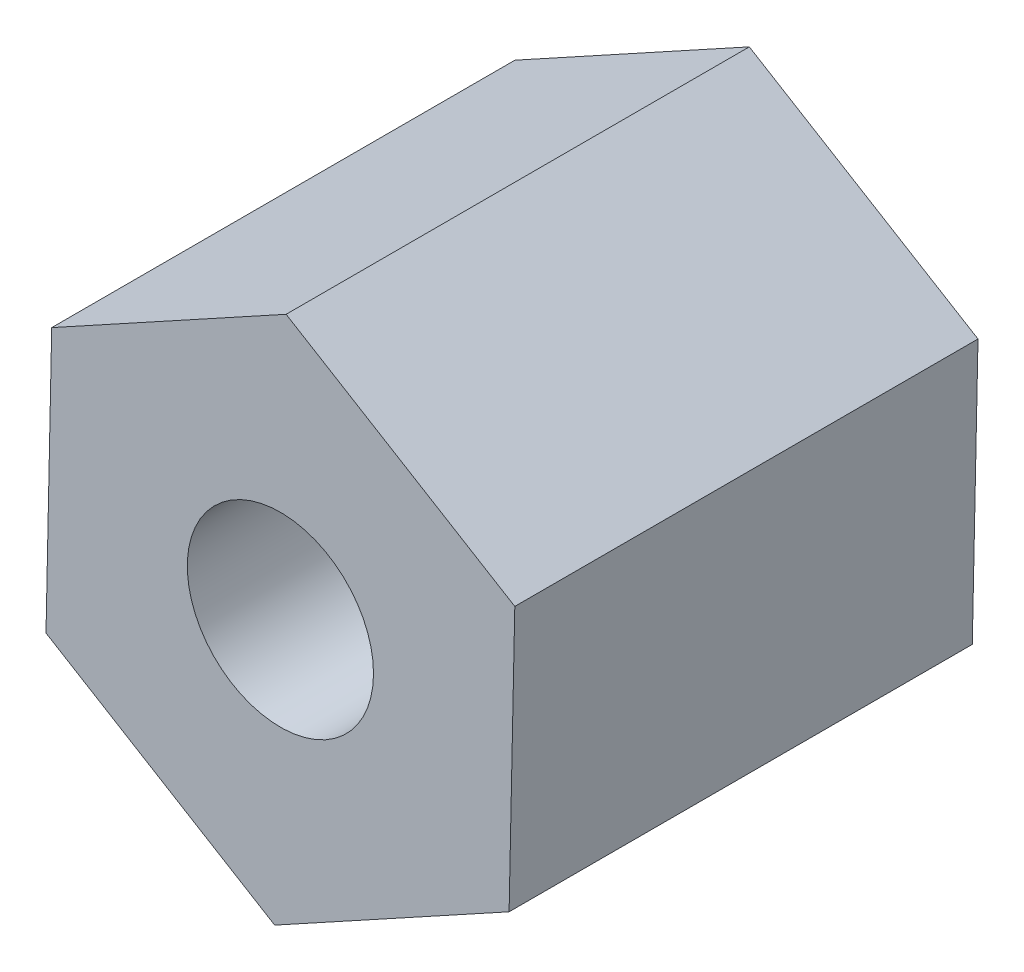
ISO-10303-21;
HEADER;
FILE_DESCRIPTION(('STEP AP214'),'2;1');
FILE_NAME('part.step','',(''),(''),'','','');
FILE_SCHEMA(('AUTOMOTIVE_DESIGN { 1 0 10303 214 1 1 1 1 }'));
ENDSEC;
DATA;
#1=APPLICATION_CONTEXT('core data for automotive mechanical design processes');
#2=APPLICATION_PROTOCOL_DEFINITION('international standard','automotive_design',2000,#1);
#3=PRODUCT_CONTEXT('',#1,'mechanical');
#4=PRODUCT('Part','Part','',(#3));
#5=PRODUCT_RELATED_PRODUCT_CATEGORY('part','',(#4));
#6=PRODUCT_DEFINITION_FORMATION('','',#4);
#7=PRODUCT_DEFINITION_CONTEXT('part definition',#1,'design');
#8=PRODUCT_DEFINITION('design','',#6,#7);
#9=PRODUCT_DEFINITION_SHAPE('','',#8);
#10=(LENGTH_UNIT() NAMED_UNIT(*) SI_UNIT(.MILLI.,.METRE.));
#11=(NAMED_UNIT(*) PLANE_ANGLE_UNIT() SI_UNIT($,.RADIAN.));
#12=(NAMED_UNIT(*) SI_UNIT($,.STERADIAN.) SOLID_ANGLE_UNIT());
#13=UNCERTAINTY_MEASURE_WITH_UNIT(LENGTH_MEASURE(1.E-05),#10,'distance_accuracy_value','');
#14=(GEOMETRIC_REPRESENTATION_CONTEXT(3) GLOBAL_UNCERTAINTY_ASSIGNED_CONTEXT((#13)) GLOBAL_UNIT_ASSIGNED_CONTEXT((#10,
#11,#12)) REPRESENTATION_CONTEXT('',''));
#15=CARTESIAN_POINT('',(0.,0.,0.));
#16=DIRECTION('',(0.,0.,1.));
#17=DIRECTION('',(1.,0.,0.));
#18=AXIS2_PLACEMENT_3D('',#15,#16,#17);
#19=CARTESIAN_POINT('',(-0.156631064855326,-7.33067527877586,12.7));
#20=DIRECTION('',(-0.481386174884368,0.876508614122072,0.));
#21=DIRECTION('',(-0.876508614122073,-0.481386174884369,0.));
#22=AXIS2_PLACEMENT_3D('',#19,#20,#21);
#23=PLANE('',#22);
#24=DIRECTION('',(0.876508614122072,0.481386174884369,0.));
#25=VECTOR('',#24,1.);
#26=CARTESIAN_POINT('',(-0.156631064855326,-7.33067527877586,0.));
#27=LINE('',#26,#25);
#28=CARTESIAN_POINT('',(-0.156631064855326,-7.33067527877586,0.));
#29=VERTEX_POINT('',#28);
#30=CARTESIAN_POINT('',(6.27023548588681,-3.80098412057446,0.));
#31=VERTEX_POINT('',#30);
#32=EDGE_CURVE('E116',#29,#31,#27,.T.);
#33=ORIENTED_EDGE('',*,*,#32,.T.);
#34=DIRECTION('',(0.,0.,-1.));
#35=VECTOR('',#34,1.);
#36=CARTESIAN_POINT('',(6.27023548588681,-3.80098412057446,12.7));
#37=LINE('',#36,#35);
#38=CARTESIAN_POINT('',(6.27023548588681,-3.80098412057446,12.7));
#39=VERTEX_POINT('',#38);
#40=EDGE_CURVE('E11',#39,#31,#37,.T.);
#41=ORIENTED_EDGE('',*,*,#40,.F.);
#42=DIRECTION('',(0.876508614122072,0.481386174884369,0.));
#43=VECTOR('',#42,1.);
#44=CARTESIAN_POINT('',(-0.156631064855326,-7.33067527877586,12.7));
#45=LINE('',#44,#43);
#46=CARTESIAN_POINT('',(-0.156631064855326,-7.33067527877586,12.7));
#47=VERTEX_POINT('',#46);
#48=EDGE_CURVE('E127',#47,#39,#45,.T.);
#49=ORIENTED_EDGE('',*,*,#48,.F.);
#50=DIRECTION('',(0.,0.,-1.));
#51=VECTOR('',#50,1.);
#52=CARTESIAN_POINT('',(-0.156631064855326,-7.33067527877586,12.7));
#53=LINE('',#52,#51);
#54=EDGE_CURVE('E112',#47,#29,#53,.T.);
#55=ORIENTED_EDGE('',*,*,#54,.T.);
#56=EDGE_LOOP('',(#33,#41,#49,#55));
#57=FACE_BOUND('',#56,.T.);
#58=ADVANCED_FACE('F32',(#57),#23,.F.);
#59=CARTESIAN_POINT('',(6.27023548588681,-3.80098412057446,12.7));
#60=DIRECTION('',(-0.999771813907791,0.0213616505805546,0.));
#61=DIRECTION('',(-0.0213616505805546,-0.999771813907791,0.));
#62=AXIS2_PLACEMENT_3D('',#59,#60,#61);
#63=PLANE('',#62);
#64=DIRECTION('',(0.0213616505805546,0.999771813907791,0.));
#65=VECTOR('',#64,1.);
#66=CARTESIAN_POINT('',(6.27023548588681,-3.80098412057446,0.));
#67=LINE('',#66,#65);
#68=CARTESIAN_POINT('',(6.42686655074214,3.52969115820141,0.));
#69=VERTEX_POINT('',#68);
#70=EDGE_CURVE('E119',#31,#69,#67,.T.);
#71=ORIENTED_EDGE('',*,*,#70,.T.);
#72=DIRECTION('',(0.,0.,-1.));
#73=VECTOR('',#72,1.);
#74=CARTESIAN_POINT('',(6.42686655074214,3.52969115820141,12.7));
#75=LINE('',#74,#73);
#76=CARTESIAN_POINT('',(6.42686655074214,3.52969115820141,12.7));
#77=VERTEX_POINT('',#76);
#78=EDGE_CURVE('E40',#77,#69,#75,.T.);
#79=ORIENTED_EDGE('',*,*,#78,.F.);
#80=DIRECTION('',(0.0213616505805546,0.999771813907791,0.));
#81=VECTOR('',#80,1.);
#82=CARTESIAN_POINT('',(6.27023548588681,-3.80098412057446,12.7));
#83=LINE('',#82,#81);
#84=EDGE_CURVE('E85',#39,#77,#83,.T.);
#85=ORIENTED_EDGE('',*,*,#84,.F.);
#86=ORIENTED_EDGE('',*,*,#40,.T.);
#87=EDGE_LOOP('',(#71,#79,#85,#86));
#88=FACE_BOUND('',#87,.T.);
#89=ADVANCED_FACE('F152',(#88),#63,.F.);
#90=CARTESIAN_POINT('',(6.42686655074214,3.52969115820141,12.7));
#91=DIRECTION('',(-0.518385639023422,-0.855146963541518,0.));
#92=DIRECTION('',(0.855146963541518,-0.518385639023422,0.));
#93=AXIS2_PLACEMENT_3D('',#90,#91,#92);
#94=PLANE('',#93);
#95=DIRECTION('',(-0.855146963541518,0.518385639023422,0.));
#96=VECTOR('',#95,1.);
#97=CARTESIAN_POINT('',(6.42686655074214,3.52969115820141,0.));
#98=LINE('',#97,#96);
#99=CARTESIAN_POINT('',(0.156631064855326,7.33067527877586,0.));
#100=VERTEX_POINT('',#99);
#101=EDGE_CURVE('E122',#69,#100,#98,.T.);
#102=ORIENTED_EDGE('',*,*,#101,.T.);
#103=DIRECTION('',(0.,0.,-1.));
#104=VECTOR('',#103,1.);
#105=CARTESIAN_POINT('',(0.156631064855326,7.33067527877586,12.7));
#106=LINE('',#105,#104);
#107=CARTESIAN_POINT('',(0.156631064855326,7.33067527877586,12.7));
#108=VERTEX_POINT('',#107);
#109=EDGE_CURVE('E107',#108,#100,#106,.T.);
#110=ORIENTED_EDGE('',*,*,#109,.F.);
#111=DIRECTION('',(-0.855146963541518,0.518385639023422,0.));
#112=VECTOR('',#111,1.);
#113=CARTESIAN_POINT('',(6.42686655074214,3.52969115820141,12.7));
#114=LINE('',#113,#112);
#115=EDGE_CURVE('E98',#77,#108,#114,.T.);
#116=ORIENTED_EDGE('',*,*,#115,.F.);
#117=ORIENTED_EDGE('',*,*,#78,.T.);
#118=EDGE_LOOP('',(#102,#110,#116,#117));
#119=FACE_BOUND('',#118,.T.);
#120=ADVANCED_FACE('F133',(#119),#94,.F.);
#121=CARTESIAN_POINT('',(0.156631064855326,7.33067527877586,12.7));
#122=DIRECTION('',(0.481386174884368,-0.876508614122072,0.));
#123=DIRECTION('',(0.876508614122073,0.481386174884369,0.));
#124=AXIS2_PLACEMENT_3D('',#121,#122,#123);
#125=PLANE('',#124);
#126=DIRECTION('',(-0.876508614122073,-0.481386174884368,0.));
#127=VECTOR('',#126,1.);
#128=CARTESIAN_POINT('',(0.156631064855326,7.33067527877586,0.));
#129=LINE('',#128,#127);
#130=CARTESIAN_POINT('',(-6.27023548588681,3.80098412057446,0.));
#131=VERTEX_POINT('',#130);
#132=EDGE_CURVE('E106',#100,#131,#129,.T.);
#133=ORIENTED_EDGE('',*,*,#132,.T.);
#134=DIRECTION('',(0.,0.,-1.));
#135=VECTOR('',#134,1.);
#136=CARTESIAN_POINT('',(-6.27023548588681,3.80098412057446,12.7));
#137=LINE('',#136,#135);
#138=CARTESIAN_POINT('',(-6.27023548588681,3.80098412057446,12.7));
#139=VERTEX_POINT('',#138);
#140=EDGE_CURVE('E103',#139,#131,#137,.T.);
#141=ORIENTED_EDGE('',*,*,#140,.F.);
#142=DIRECTION('',(-0.876508614122073,-0.481386174884368,0.));
#143=VECTOR('',#142,1.);
#144=CARTESIAN_POINT('',(0.156631064855326,7.33067527877586,12.7));
#145=LINE('',#144,#143);
#146=EDGE_CURVE('E92',#108,#139,#145,.T.);
#147=ORIENTED_EDGE('',*,*,#146,.F.);
#148=ORIENTED_EDGE('',*,*,#109,.T.);
#149=EDGE_LOOP('',(#133,#141,#147,#148));
#150=FACE_BOUND('',#149,.T.);
#151=ADVANCED_FACE('F104',(#150),#125,.F.);
#152=CARTESIAN_POINT('',(-6.27023548588681,3.80098412057446,12.7));
#153=DIRECTION('',(0.999771813907791,-0.0213616505805544,0.));
#154=DIRECTION('',(0.0213616505805544,0.999771813907791,0.));
#155=AXIS2_PLACEMENT_3D('',#152,#153,#154);
#156=PLANE('',#155);
#157=DIRECTION('',(-0.0213616505805544,-0.999771813907791,0.));
#158=VECTOR('',#157,1.);
#159=CARTESIAN_POINT('',(-6.27023548588681,3.80098412057446,0.));
#160=LINE('',#159,#158);
#161=CARTESIAN_POINT('',(-6.42686655074213,-3.52969115820141,0.));
#162=VERTEX_POINT('',#161);
#163=EDGE_CURVE('E71',#131,#162,#160,.T.);
#164=ORIENTED_EDGE('',*,*,#163,.T.);
#165=DIRECTION('',(0.,0.,-1.));
#166=VECTOR('',#165,1.);
#167=CARTESIAN_POINT('',(-6.42686655074213,-3.52969115820141,12.7));
#168=LINE('',#167,#166);
#169=CARTESIAN_POINT('',(-6.42686655074213,-3.52969115820141,12.7));
#170=VERTEX_POINT('',#169);
#171=EDGE_CURVE('E108',#170,#162,#168,.T.);
#172=ORIENTED_EDGE('',*,*,#171,.F.);
#173=DIRECTION('',(-0.0213616505805544,-0.999771813907791,0.));
#174=VECTOR('',#173,1.);
#175=CARTESIAN_POINT('',(-6.27023548588681,3.80098412057446,12.7));
#176=LINE('',#175,#174);
#177=EDGE_CURVE('E96',#139,#170,#176,.T.);
#178=ORIENTED_EDGE('',*,*,#177,.F.);
#179=ORIENTED_EDGE('',*,*,#140,.T.);
#180=EDGE_LOOP('',(#164,#172,#178,#179));
#181=FACE_BOUND('',#180,.T.);
#182=ADVANCED_FACE('F110',(#181),#156,.F.);
#183=CARTESIAN_POINT('',(-6.42686655074213,-3.52969115820141,12.7));
#184=DIRECTION('',(0.518385639023422,0.855146963541518,0.));
#185=DIRECTION('',(-0.855146963541518,0.518385639023422,0.));
#186=AXIS2_PLACEMENT_3D('',#183,#184,#185);
#187=PLANE('',#186);
#188=DIRECTION('',(0.855146963541518,-0.518385639023422,0.));
#189=VECTOR('',#188,1.);
#190=CARTESIAN_POINT('',(-6.42686655074213,-3.52969115820141,0.));
#191=LINE('',#190,#189);
#192=EDGE_CURVE('E77',#162,#29,#191,.T.);
#193=ORIENTED_EDGE('',*,*,#192,.T.);
#194=ORIENTED_EDGE('',*,*,#54,.F.);
#195=DIRECTION('',(0.855146963541518,-0.518385639023422,0.));
#196=VECTOR('',#195,1.);
#197=CARTESIAN_POINT('',(-6.42686655074213,-3.52969115820141,12.7));
#198=LINE('',#197,#196);
#199=EDGE_CURVE('E48',#170,#47,#198,.T.);
#200=ORIENTED_EDGE('',*,*,#199,.F.);
#201=ORIENTED_EDGE('',*,*,#171,.T.);
#202=EDGE_LOOP('',(#193,#194,#200,#201));
#203=FACE_BOUND('',#202,.T.);
#204=ADVANCED_FACE('F140',(#203),#187,.F.);
#205=CARTESIAN_POINT('',(0.,0.,12.7));
#206=DIRECTION('',(0.,0.,1.));
#207=DIRECTION('',(1.,0.,0.));
#208=AXIS2_PLACEMENT_3D('',#205,#206,#207);
#209=PLANE('',#208);
#210=CARTESIAN_POINT('',(0.,0.,12.7));
#211=DIRECTION('',(0.,0.,1.));
#212=DIRECTION('',(1.,0.,0.));
#213=AXIS2_PLACEMENT_3D('',#210,#211,#212);
#214=CIRCLE('',#213,2.5527);
#215=CARTESIAN_POINT('',(2.5527,0.,12.7));
#216=VERTEX_POINT('',#215);
#217=EDGE_CURVE('E207',#216,#216,#214,.T.);
#218=ORIENTED_EDGE('',*,*,#217,.F.);
#219=EDGE_LOOP('',(#218));
#220=FACE_BOUND('',#219,.T.);
#221=ORIENTED_EDGE('',*,*,#48,.T.);
#222=ORIENTED_EDGE('',*,*,#84,.T.);
#223=ORIENTED_EDGE('',*,*,#115,.T.);
#224=ORIENTED_EDGE('',*,*,#146,.T.);
#225=ORIENTED_EDGE('',*,*,#177,.T.);
#226=ORIENTED_EDGE('',*,*,#199,.T.);
#227=EDGE_LOOP('',(#221,#222,#223,#224,#225,#226));
#228=FACE_BOUND('',#227,.T.);
#229=ADVANCED_FACE('F94',(#220,#228),#209,.T.);
#230=CARTESIAN_POINT('',(0.,0.,0.));
#231=DIRECTION('',(0.,0.,1.));
#232=DIRECTION('',(1.,0.,0.));
#233=AXIS2_PLACEMENT_3D('',#230,#231,#232);
#234=PLANE('',#233);
#235=CARTESIAN_POINT('',(0.,0.,0.));
#236=DIRECTION('',(0.,0.,1.));
#237=DIRECTION('',(1.,0.,0.));
#238=AXIS2_PLACEMENT_3D('',#235,#236,#237);
#239=CIRCLE('',#238,2.5527);
#240=CARTESIAN_POINT('',(2.5527,0.,0.));
#241=VERTEX_POINT('',#240);
#242=EDGE_CURVE('E120',#241,#241,#239,.T.);
#243=ORIENTED_EDGE('',*,*,#242,.T.);
#244=EDGE_LOOP('',(#243));
#245=FACE_BOUND('',#244,.T.);
#246=ORIENTED_EDGE('',*,*,#32,.F.);
#247=ORIENTED_EDGE('',*,*,#192,.F.);
#248=ORIENTED_EDGE('',*,*,#163,.F.);
#249=ORIENTED_EDGE('',*,*,#132,.F.);
#250=ORIENTED_EDGE('',*,*,#101,.F.);
#251=ORIENTED_EDGE('',*,*,#70,.F.);
#252=EDGE_LOOP('',(#246,#247,#248,#249,#250,#251));
#253=FACE_BOUND('',#252,.T.);
#254=ADVANCED_FACE('F136',(#245,#253),#234,.F.);
#255=CARTESIAN_POINT('',(0.,0.,12.7));
#256=DIRECTION('',(0.,0.,1.));
#257=DIRECTION('',(1.,0.,0.));
#258=AXIS2_PLACEMENT_3D('',#255,#256,#257);
#259=CYLINDRICAL_SURFACE('',#258,2.5527);
#260=ORIENTED_EDGE('',*,*,#242,.F.);
#261=EDGE_LOOP('',(#260));
#262=FACE_BOUND('',#261,.T.);
#263=ORIENTED_EDGE('',*,*,#217,.T.);
#264=EDGE_LOOP('',(#263));
#265=FACE_BOUND('',#264,.T.);
#266=ADVANCED_FACE('F189',(#262,#265),#259,.F.);
#267=CLOSED_SHELL('',(#58,#89,#120,#151,#182,#204,#229,#254,#266));
#268=MANIFOLD_SOLID_BREP('B2',#267);
#269=ADVANCED_BREP_SHAPE_REPRESENTATION('',(#18,#268),#14);
#270=SHAPE_DEFINITION_REPRESENTATION(#9,#269);
ENDSEC;
END-ISO-10303-21;
